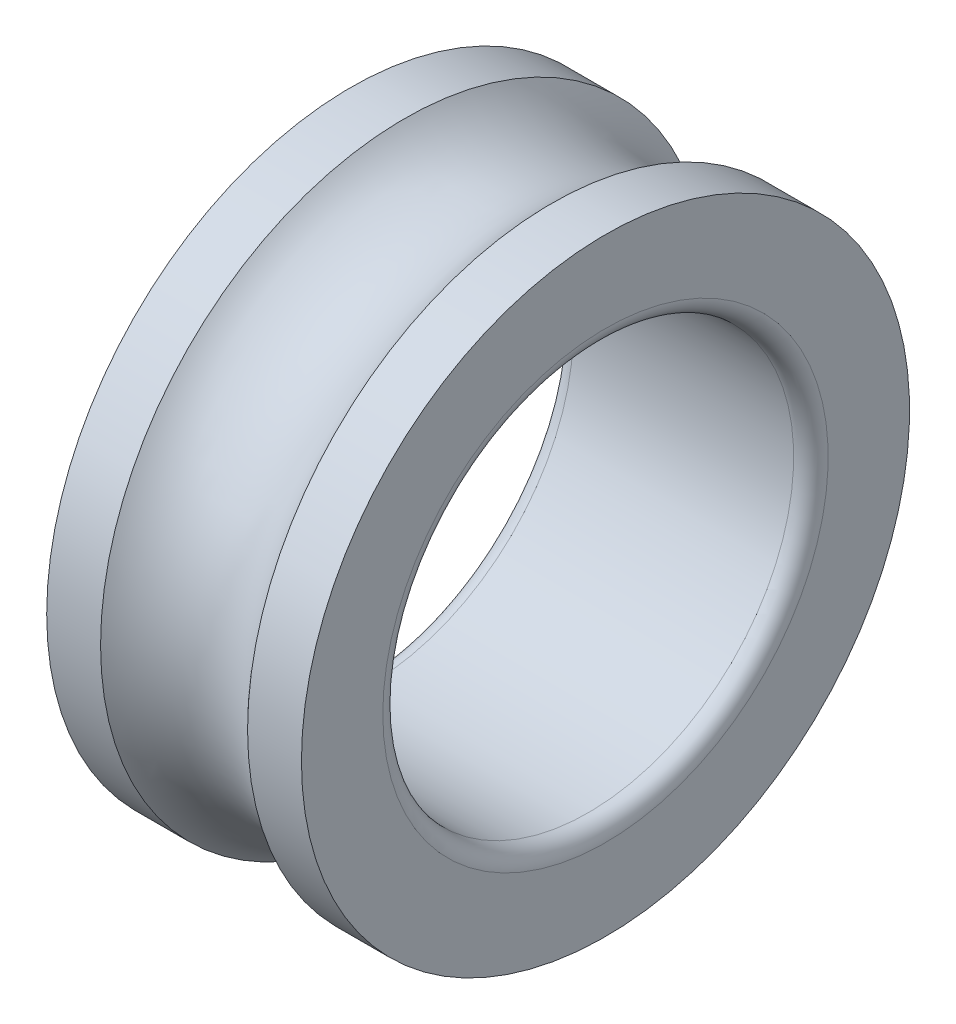
ISO-10303-21;
HEADER;
FILE_DESCRIPTION(('STEP AP214'),'2;1');
FILE_NAME('part.step','',(''),(''),'','','');
FILE_SCHEMA(('AUTOMOTIVE_DESIGN { 1 0 10303 214 1 1 1 1 }'));
ENDSEC;
DATA;
#1=APPLICATION_CONTEXT('core data for automotive mechanical design processes');
#2=APPLICATION_PROTOCOL_DEFINITION('international standard','automotive_design',2000,#1);
#3=PRODUCT_CONTEXT('',#1,'mechanical');
#4=PRODUCT('Part','Part','',(#3));
#5=PRODUCT_RELATED_PRODUCT_CATEGORY('part','',(#4));
#6=PRODUCT_DEFINITION_FORMATION('','',#4);
#7=PRODUCT_DEFINITION_CONTEXT('part definition',#1,'design');
#8=PRODUCT_DEFINITION('design','',#6,#7);
#9=PRODUCT_DEFINITION_SHAPE('','',#8);
#10=(LENGTH_UNIT() NAMED_UNIT(*) SI_UNIT(.MILLI.,.METRE.));
#11=(NAMED_UNIT(*) PLANE_ANGLE_UNIT() SI_UNIT($,.RADIAN.));
#12=(NAMED_UNIT(*) SI_UNIT($,.STERADIAN.) SOLID_ANGLE_UNIT());
#13=UNCERTAINTY_MEASURE_WITH_UNIT(LENGTH_MEASURE(1.E-05),#10,'distance_accuracy_value','');
#14=(GEOMETRIC_REPRESENTATION_CONTEXT(3) GLOBAL_UNCERTAINTY_ASSIGNED_CONTEXT((#13)) GLOBAL_UNIT_ASSIGNED_CONTEXT((#10,
#11,#12)) REPRESENTATION_CONTEXT('',''));
#15=CARTESIAN_POINT('',(0.,0.,0.));
#16=DIRECTION('',(0.,0.,1.));
#17=DIRECTION('',(1.,0.,0.));
#18=AXIS2_PLACEMENT_3D('',#15,#16,#17);
#19=CARTESIAN_POINT('',(-8.987985,21.45519,0.));
#20=DIRECTION('',(1.,0.,0.));
#21=DIRECTION('',(0.,0.,-1.));
#22=AXIS2_PLACEMENT_3D('',#19,#20,#21);
#23=PLANE('',#22);
#24=CARTESIAN_POINT('',(-8.987985,0.,0.));
#25=DIRECTION('',(-1.,0.,0.));
#26=DIRECTION('',(0.,0.,1.));
#27=AXIS2_PLACEMENT_3D('',#24,#25,#26);
#28=CIRCLE('',#27,15.714477);
#29=CARTESIAN_POINT('',(-8.987985,0.,15.714477));
#30=VERTEX_POINT('',#29);
#31=EDGE_CURVE('E64',#30,#30,#28,.T.);
#32=ORIENTED_EDGE('',*,*,#31,.F.);
#33=EDGE_LOOP('',(#32));
#34=FACE_BOUND('',#33,.T.);
#35=CARTESIAN_POINT('',(-8.987985,0.,0.));
#36=DIRECTION('',(-1.,0.,0.));
#37=DIRECTION('',(0.,0.,1.));
#38=AXIS2_PLACEMENT_3D('',#35,#36,#37);
#39=CIRCLE('',#38,21.45519);
#40=CARTESIAN_POINT('',(-8.987985,0.,21.45519));
#41=VERTEX_POINT('',#40);
#42=EDGE_CURVE('E10',#41,#41,#39,.T.);
#43=ORIENTED_EDGE('',*,*,#42,.T.);
#44=EDGE_LOOP('',(#43));
#45=FACE_BOUND('',#44,.T.);
#46=ADVANCED_FACE('F36',(#34,#45),#23,.F.);
#47=CARTESIAN_POINT('',(-18.0584285779817,0.,0.));
#48=DIRECTION('',(-1.,0.,0.));
#49=DIRECTION('',(0.,0.,1.));
#50=AXIS2_PLACEMENT_3D('',#47,#48,#49);
#51=CYLINDRICAL_SURFACE('',#50,21.45519);
#52=ORIENTED_EDGE('',*,*,#42,.F.);
#53=EDGE_LOOP('',(#52));
#54=FACE_BOUND('',#53,.T.);
#55=CARTESIAN_POINT('',(-5.18651495245122,0.,0.));
#56=DIRECTION('',(-1.,0.,0.));
#57=DIRECTION('',(0.,0.,1.));
#58=AXIS2_PLACEMENT_3D('',#55,#56,#57);
#59=CIRCLE('',#58,21.45519);
#60=CARTESIAN_POINT('',(-5.18651495245122,0.,21.45519));
#61=VERTEX_POINT('',#60);
#62=EDGE_CURVE('E42',#61,#61,#59,.T.);
#63=ORIENTED_EDGE('',*,*,#62,.T.);
#64=EDGE_LOOP('',(#63));
#65=FACE_BOUND('',#64,.T.);
#66=ADVANCED_FACE('F71',(#54,#65),#51,.T.);
#67=CARTESIAN_POINT('',(0.,0.,0.));
#68=DIRECTION('',(-1.,0.,0.));
#69=DIRECTION('',(0.,0.,1.));
#70=AXIS2_PLACEMENT_3D('',#67,#68,#69);
#71=TOROIDAL_SURFACE('',#70,26.09415,6.95844);
#72=ORIENTED_EDGE('',*,*,#62,.F.);
#73=EDGE_LOOP('',(#72));
#74=FACE_BOUND('',#73,.T.);
#75=CARTESIAN_POINT('',(5.18651495245121,0.,0.));
#76=DIRECTION('',(-1.,0.,0.));
#77=DIRECTION('',(0.,0.,1.));
#78=AXIS2_PLACEMENT_3D('',#75,#76,#77);
#79=CIRCLE('',#78,21.45519);
#80=CARTESIAN_POINT('',(5.18651495245121,0.,21.45519));
#81=VERTEX_POINT('',#80);
#82=EDGE_CURVE('E46',#81,#81,#79,.T.);
#83=ORIENTED_EDGE('',*,*,#82,.T.);
#84=EDGE_LOOP('',(#83));
#85=FACE_BOUND('',#84,.T.);
#86=ADVANCED_FACE('F75',(#74,#85),#71,.F.);
#87=CARTESIAN_POINT('',(-18.0584285779817,0.,0.));
#88=DIRECTION('',(-1.,0.,0.));
#89=DIRECTION('',(0.,0.,1.));
#90=AXIS2_PLACEMENT_3D('',#87,#88,#89);
#91=CYLINDRICAL_SURFACE('',#90,21.45519);
#92=ORIENTED_EDGE('',*,*,#82,.F.);
#93=EDGE_LOOP('',(#92));
#94=FACE_BOUND('',#93,.T.);
#95=CARTESIAN_POINT('',(8.987985,0.,0.));
#96=DIRECTION('',(-1.,0.,0.));
#97=DIRECTION('',(0.,0.,1.));
#98=AXIS2_PLACEMENT_3D('',#95,#96,#97);
#99=CIRCLE('',#98,21.45519);
#100=CARTESIAN_POINT('',(8.987985,0.,21.45519));
#101=VERTEX_POINT('',#100);
#102=EDGE_CURVE('E50',#101,#101,#99,.T.);
#103=ORIENTED_EDGE('',*,*,#102,.T.);
#104=EDGE_LOOP('',(#103));
#105=FACE_BOUND('',#104,.T.);
#106=ADVANCED_FACE('F80',(#94,#105),#91,.T.);
#107=CARTESIAN_POINT('',(8.987985,21.45519,0.));
#108=DIRECTION('',(-1.,0.,0.));
#109=DIRECTION('',(0.,0.,1.));
#110=AXIS2_PLACEMENT_3D('',#107,#108,#109);
#111=PLANE('',#110);
#112=ORIENTED_EDGE('',*,*,#102,.F.);
#113=EDGE_LOOP('',(#112));
#114=FACE_BOUND('',#113,.T.);
#115=CARTESIAN_POINT('',(8.987985,0.,0.));
#116=DIRECTION('',(-1.,0.,0.));
#117=DIRECTION('',(0.,0.,1.));
#118=AXIS2_PLACEMENT_3D('',#115,#116,#117);
#119=CIRCLE('',#118,15.714477);
#120=CARTESIAN_POINT('',(8.987985,0.,15.714477));
#121=VERTEX_POINT('',#120);
#122=EDGE_CURVE('E55',#121,#121,#119,.T.);
#123=ORIENTED_EDGE('',*,*,#122,.T.);
#124=EDGE_LOOP('',(#123));
#125=FACE_BOUND('',#124,.T.);
#126=ADVANCED_FACE('F86',(#114,#125),#111,.F.);
#127=CARTESIAN_POINT('',(7.770258,0.,0.));
#128=DIRECTION('',(-1.,0.,0.));
#129=DIRECTION('',(0.,0.,1.));
#130=AXIS2_PLACEMENT_3D('',#127,#128,#129);
#131=TOROIDAL_SURFACE('',#130,15.714477,1.217727);
#132=ORIENTED_EDGE('',*,*,#122,.F.);
#133=EDGE_LOOP('',(#132));
#134=FACE_BOUND('',#133,.T.);
#135=CARTESIAN_POINT('',(7.770258,0.,0.));
#136=DIRECTION('',(-1.,0.,0.));
#137=DIRECTION('',(0.,0.,1.));
#138=AXIS2_PLACEMENT_3D('',#135,#136,#137);
#139=CIRCLE('',#138,14.49675);
#140=CARTESIAN_POINT('',(7.770258,0.,14.49675));
#141=VERTEX_POINT('',#140);
#142=EDGE_CURVE('E58',#141,#141,#139,.T.);
#143=ORIENTED_EDGE('',*,*,#142,.T.);
#144=EDGE_LOOP('',(#143));
#145=FACE_BOUND('',#144,.T.);
#146=ADVANCED_FACE('F90',(#134,#145),#131,.T.);
#147=CARTESIAN_POINT('',(-18.0584285779817,0.,0.));
#148=DIRECTION('',(-1.,0.,0.));
#149=DIRECTION('',(0.,0.,1.));
#150=AXIS2_PLACEMENT_3D('',#147,#148,#149);
#151=CYLINDRICAL_SURFACE('',#150,14.49675);
#152=ORIENTED_EDGE('',*,*,#142,.F.);
#153=EDGE_LOOP('',(#152));
#154=FACE_BOUND('',#153,.T.);
#155=CARTESIAN_POINT('',(-7.770258,0.,0.));
#156=DIRECTION('',(-1.,0.,0.));
#157=DIRECTION('',(0.,0.,1.));
#158=AXIS2_PLACEMENT_3D('',#155,#156,#157);
#159=CIRCLE('',#158,14.49675);
#160=CARTESIAN_POINT('',(-7.770258,0.,14.49675));
#161=VERTEX_POINT('',#160);
#162=EDGE_CURVE('E61',#161,#161,#159,.T.);
#163=ORIENTED_EDGE('',*,*,#162,.T.);
#164=EDGE_LOOP('',(#163));
#165=FACE_BOUND('',#164,.T.);
#166=ADVANCED_FACE('F94',(#154,#165),#151,.F.);
#167=CARTESIAN_POINT('',(-7.770258,0.,0.));
#168=DIRECTION('',(-1.,0.,0.));
#169=DIRECTION('',(0.,0.,1.));
#170=AXIS2_PLACEMENT_3D('',#167,#168,#169);
#171=TOROIDAL_SURFACE('',#170,15.714477,1.217727);
#172=ORIENTED_EDGE('',*,*,#162,.F.);
#173=EDGE_LOOP('',(#172));
#174=FACE_BOUND('',#173,.T.);
#175=ORIENTED_EDGE('',*,*,#31,.T.);
#176=EDGE_LOOP('',(#175));
#177=FACE_BOUND('',#176,.T.);
#178=ADVANCED_FACE('F68',(#174,#177),#171,.T.);
#179=CLOSED_SHELL('',(#46,#66,#86,#106,#126,#146,#166,#178));
#180=MANIFOLD_SOLID_BREP('B2',#179);
#181=ADVANCED_BREP_SHAPE_REPRESENTATION('',(#18,#180),#14);
#182=SHAPE_DEFINITION_REPRESENTATION(#9,#181);
ENDSEC;
END-ISO-10303-21;
